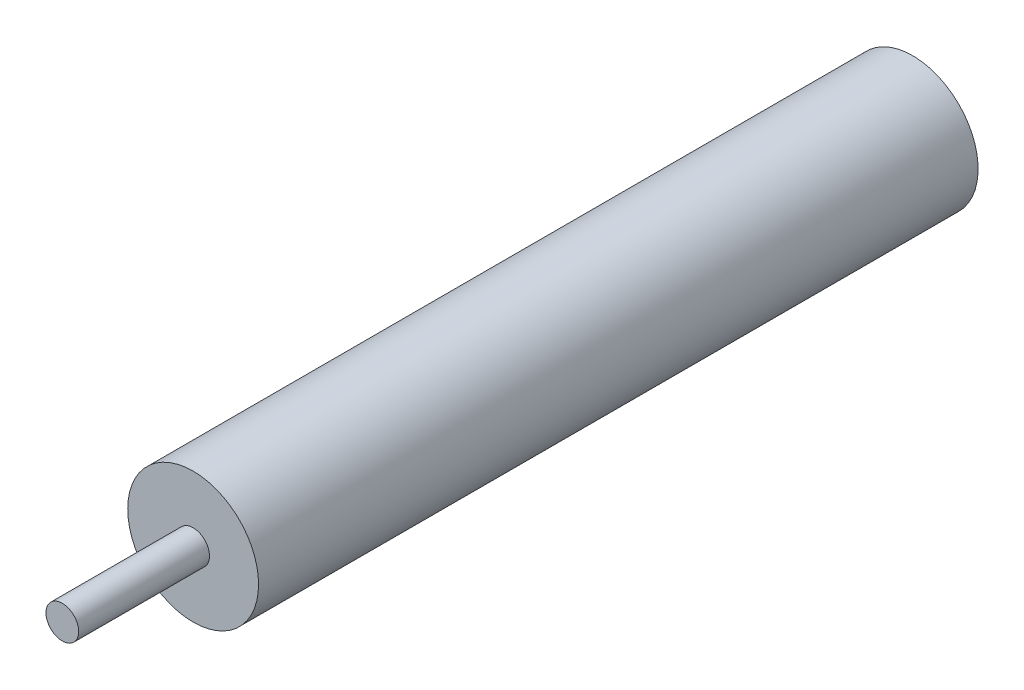
ISO-10303-21;
HEADER;
FILE_DESCRIPTION(('STEP AP214'),'2;1');
FILE_NAME('part.step','',(''),(''),'','','');
FILE_SCHEMA(('AUTOMOTIVE_DESIGN { 1 0 10303 214 1 1 1 1 }'));
ENDSEC;
DATA;
#1=APPLICATION_CONTEXT('core data for automotive mechanical design processes');
#2=APPLICATION_PROTOCOL_DEFINITION('international standard','automotive_design',2000,#1);
#3=PRODUCT_CONTEXT('',#1,'mechanical');
#4=PRODUCT('Part','Part','',(#3));
#5=PRODUCT_RELATED_PRODUCT_CATEGORY('part','',(#4));
#6=PRODUCT_DEFINITION_FORMATION('','',#4);
#7=PRODUCT_DEFINITION_CONTEXT('part definition',#1,'design');
#8=PRODUCT_DEFINITION('design','',#6,#7);
#9=PRODUCT_DEFINITION_SHAPE('','',#8);
#10=(LENGTH_UNIT() NAMED_UNIT(*) SI_UNIT(.MILLI.,.METRE.));
#11=(NAMED_UNIT(*) PLANE_ANGLE_UNIT() SI_UNIT($,.RADIAN.));
#12=(NAMED_UNIT(*) SI_UNIT($,.STERADIAN.) SOLID_ANGLE_UNIT());
#13=UNCERTAINTY_MEASURE_WITH_UNIT(LENGTH_MEASURE(1.E-05),#10,'distance_accuracy_value','');
#14=(GEOMETRIC_REPRESENTATION_CONTEXT(3) GLOBAL_UNCERTAINTY_ASSIGNED_CONTEXT((#13)) GLOBAL_UNIT_ASSIGNED_CONTEXT((#10,
#11,#12)) REPRESENTATION_CONTEXT('',''));
#15=CARTESIAN_POINT('',(0.,0.,0.));
#16=DIRECTION('',(0.,0.,1.));
#17=DIRECTION('',(1.,0.,0.));
#18=AXIS2_PLACEMENT_3D('',#15,#16,#17);
#19=CARTESIAN_POINT('',(0.,0.,95.));
#20=DIRECTION('',(0.,0.,-1.));
#21=DIRECTION('',(-1.,0.,0.));
#22=AXIS2_PLACEMENT_3D('',#19,#20,#21);
#23=CYLINDRICAL_SURFACE('',#22,10.);
#24=CARTESIAN_POINT('',(0.,0.,95.));
#25=DIRECTION('',(0.,0.,1.));
#26=DIRECTION('',(1.,0.,0.));
#27=AXIS2_PLACEMENT_3D('',#24,#25,#26);
#28=CIRCLE('',#27,10.);
#29=CARTESIAN_POINT('',(10.,0.,95.));
#30=VERTEX_POINT('',#29);
#31=EDGE_CURVE('E41',#30,#30,#28,.T.);
#32=ORIENTED_EDGE('',*,*,#31,.F.);
#33=EDGE_LOOP('',(#32));
#34=FACE_BOUND('',#33,.T.);
#35=CARTESIAN_POINT('',(0.,0.,-15.));
#36=DIRECTION('',(0.,0.,-1.));
#37=DIRECTION('',(-1.,0.,0.));
#38=AXIS2_PLACEMENT_3D('',#35,#36,#37);
#39=CIRCLE('',#38,10.);
#40=CARTESIAN_POINT('',(-10.,0.,-15.));
#41=VERTEX_POINT('',#40);
#42=EDGE_CURVE('E49',#41,#41,#39,.T.);
#43=ORIENTED_EDGE('',*,*,#42,.F.);
#44=EDGE_LOOP('',(#43));
#45=FACE_BOUND('',#44,.T.);
#46=ADVANCED_FACE('F38',(#34,#45),#23,.T.);
#47=CARTESIAN_POINT('',(0.,0.,95.));
#48=DIRECTION('',(0.,0.,1.));
#49=DIRECTION('',(1.,0.,0.));
#50=AXIS2_PLACEMENT_3D('',#47,#48,#49);
#51=PLANE('',#50);
#52=CARTESIAN_POINT('',(0.,0.,95.));
#53=DIRECTION('',(0.,0.,1.));
#54=DIRECTION('',(1.,0.,0.));
#55=AXIS2_PLACEMENT_3D('',#52,#53,#54);
#56=CIRCLE('',#55,2.5);
#57=CARTESIAN_POINT('',(2.5,0.,95.));
#58=VERTEX_POINT('',#57);
#59=EDGE_CURVE('E10',#58,#58,#56,.T.);
#60=ORIENTED_EDGE('',*,*,#59,.F.);
#61=EDGE_LOOP('',(#60));
#62=FACE_BOUND('',#61,.T.);
#63=ORIENTED_EDGE('',*,*,#31,.T.);
#64=EDGE_LOOP('',(#63));
#65=FACE_BOUND('',#64,.T.);
#66=ADVANCED_FACE('F69',(#62,#65),#51,.T.);
#67=CARTESIAN_POINT('',(0.,0.,-15.));
#68=DIRECTION('',(0.,0.,-1.));
#69=DIRECTION('',(-1.,0.,0.));
#70=AXIS2_PLACEMENT_3D('',#67,#68,#69);
#71=PLANE('',#70);
#72=ORIENTED_EDGE('',*,*,#42,.T.);
#73=EDGE_LOOP('',(#72));
#74=FACE_BOUND('',#73,.T.);
#75=ADVANCED_FACE('F62',(#74),#71,.T.);
#76=CARTESIAN_POINT('',(0.,0.,115.));
#77=DIRECTION('',(0.,0.,-1.));
#78=DIRECTION('',(-1.,0.,0.));
#79=AXIS2_PLACEMENT_3D('',#76,#77,#78);
#80=CYLINDRICAL_SURFACE('',#79,2.5);
#81=CARTESIAN_POINT('',(0.,0.,115.));
#82=DIRECTION('',(0.,0.,1.));
#83=DIRECTION('',(1.,0.,0.));
#84=AXIS2_PLACEMENT_3D('',#81,#82,#83);
#85=CIRCLE('',#84,2.5);
#86=CARTESIAN_POINT('',(2.5,0.,115.));
#87=VERTEX_POINT('',#86);
#88=EDGE_CURVE('E51',#87,#87,#85,.T.);
#89=ORIENTED_EDGE('',*,*,#88,.F.);
#90=EDGE_LOOP('',(#89));
#91=FACE_BOUND('',#90,.T.);
#92=ORIENTED_EDGE('',*,*,#59,.T.);
#93=EDGE_LOOP('',(#92));
#94=FACE_BOUND('',#93,.T.);
#95=ADVANCED_FACE('F60',(#91,#94),#80,.T.);
#96=CARTESIAN_POINT('',(0.,0.,115.));
#97=DIRECTION('',(0.,0.,1.));
#98=DIRECTION('',(1.,0.,0.));
#99=AXIS2_PLACEMENT_3D('',#96,#97,#98);
#100=PLANE('',#99);
#101=ORIENTED_EDGE('',*,*,#88,.T.);
#102=EDGE_LOOP('',(#101));
#103=FACE_BOUND('',#102,.T.);
#104=ADVANCED_FACE('F58',(#103),#100,.T.);
#105=CLOSED_SHELL('',(#46,#66,#75,#95,#104));
#106=MANIFOLD_SOLID_BREP('B2',#105);
#107=ADVANCED_BREP_SHAPE_REPRESENTATION('',(#18,#106),#14);
#108=SHAPE_DEFINITION_REPRESENTATION(#9,#107);
ENDSEC;
END-ISO-10303-21;
